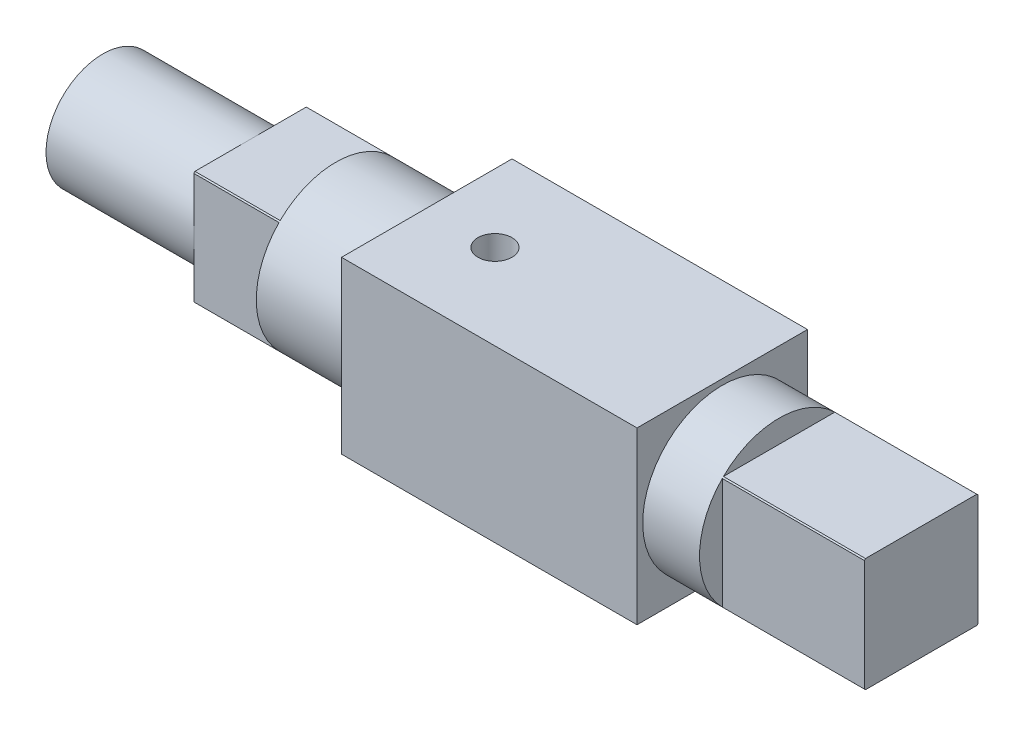
ISO-10303-21;
HEADER;
FILE_DESCRIPTION(('STEP AP214'),'2;1');
FILE_NAME('part.step','',(''),(''),'','','');
FILE_SCHEMA(('AUTOMOTIVE_DESIGN { 1 0 10303 214 1 1 1 1 }'));
ENDSEC;
DATA;
#1=APPLICATION_CONTEXT('core data for automotive mechanical design processes');
#2=APPLICATION_PROTOCOL_DEFINITION('international standard','automotive_design',2000,#1);
#3=PRODUCT_CONTEXT('',#1,'mechanical');
#4=PRODUCT('Part','Part','',(#3));
#5=PRODUCT_RELATED_PRODUCT_CATEGORY('part','',(#4));
#6=PRODUCT_DEFINITION_FORMATION('','',#4);
#7=PRODUCT_DEFINITION_CONTEXT('part definition',#1,'design');
#8=PRODUCT_DEFINITION('design','',#6,#7);
#9=PRODUCT_DEFINITION_SHAPE('','',#8);
#10=(LENGTH_UNIT() NAMED_UNIT(*) SI_UNIT(.MILLI.,.METRE.));
#11=(NAMED_UNIT(*) PLANE_ANGLE_UNIT() SI_UNIT($,.RADIAN.));
#12=(NAMED_UNIT(*) SI_UNIT($,.STERADIAN.) SOLID_ANGLE_UNIT());
#13=UNCERTAINTY_MEASURE_WITH_UNIT(LENGTH_MEASURE(1.E-05),#10,'distance_accuracy_value','');
#14=(GEOMETRIC_REPRESENTATION_CONTEXT(3) GLOBAL_UNCERTAINTY_ASSIGNED_CONTEXT((#13)) GLOBAL_UNIT_ASSIGNED_CONTEXT((#10,
#11,#12)) REPRESENTATION_CONTEXT('',''));
#15=CARTESIAN_POINT('',(0.,0.,0.));
#16=DIRECTION('',(0.,0.,1.));
#17=DIRECTION('',(1.,0.,0.));
#18=AXIS2_PLACEMENT_3D('',#15,#16,#17);
#19=CARTESIAN_POINT('',(18.,7.5,0.));
#20=DIRECTION('',(1.,0.,0.));
#21=DIRECTION('',(0.,0.,-1.));
#22=AXIS2_PLACEMENT_3D('',#19,#20,#21);
#23=PLANE('',#22);
#24=CARTESIAN_POINT('',(18.,7.5,0.));
#25=DIRECTION('',(1.,0.,0.));
#26=DIRECTION('',(0.,0.,-1.));
#27=AXIS2_PLACEMENT_3D('',#24,#25,#26);
#28=CIRCLE('',#27,7.);
#29=CARTESIAN_POINT('',(18.,12.3989794855664,5.));
#30=VERTEX_POINT('',#29);
#31=CARTESIAN_POINT('',(18.,2.60102051443365,5.));
#32=VERTEX_POINT('',#31);
#33=EDGE_CURVE('E435',#30,#32,#28,.T.);
#34=ORIENTED_EDGE('',*,*,#33,.T.);
#35=DIRECTION('',(0.,1.,0.));
#36=VECTOR('',#35,1.);
#37=CARTESIAN_POINT('',(18.,0.,5.));
#38=LINE('',#37,#36);
#39=EDGE_CURVE('E428',#32,#30,#38,.T.);
#40=ORIENTED_EDGE('',*,*,#39,.T.);
#41=EDGE_LOOP('',(#34,#40));
#42=FACE_BOUND('',#41,.T.);
#43=ADVANCED_FACE('F44',(#42),#23,.T.);
#44=CARTESIAN_POINT('',(18.,12.5,-4.89897948556635));
#45=VERTEX_POINT('',#44);
#46=CARTESIAN_POINT('',(18.,12.5,4.89897948556635));
#47=VERTEX_POINT('',#46);
#48=EDGE_CURVE('E229',#45,#47,#28,.T.);
#49=ORIENTED_EDGE('',*,*,#48,.T.);
#50=DIRECTION('',(0.,0.,-1.));
#51=VECTOR('',#50,1.);
#52=CARTESIAN_POINT('',(18.,12.5,0.));
#53=LINE('',#52,#51);
#54=EDGE_CURVE('E459',#47,#45,#53,.T.);
#55=ORIENTED_EDGE('',*,*,#54,.T.);
#56=EDGE_LOOP('',(#49,#55));
#57=FACE_BOUND('',#56,.T.);
#58=ADVANCED_FACE('F399',(#57),#23,.T.);
#59=DIRECTION('',(0.,0.,-1.));
#60=VECTOR('',#59,1.);
#61=CARTESIAN_POINT('',(18.,2.5,0.));
#62=LINE('',#61,#60);
#63=CARTESIAN_POINT('',(18.,2.5,4.89897948556636));
#64=VERTEX_POINT('',#63);
#65=CARTESIAN_POINT('',(18.,2.5,-4.89897948556636));
#66=VERTEX_POINT('',#65);
#67=EDGE_CURVE('E217',#64,#66,#62,.T.);
#68=ORIENTED_EDGE('',*,*,#67,.F.);
#69=EDGE_CURVE('E68',#64,#66,#28,.T.);
#70=ORIENTED_EDGE('',*,*,#69,.T.);
#71=EDGE_LOOP('',(#68,#70));
#72=FACE_BOUND('',#71,.T.);
#73=ADVANCED_FACE('F406',(#72),#23,.T.);
#74=CARTESIAN_POINT('',(-28.5,0.,0.));
#75=DIRECTION('',(-1.,0.,0.));
#76=DIRECTION('',(0.,0.,1.));
#77=AXIS2_PLACEMENT_3D('',#74,#75,#76);
#78=PLANE('',#77);
#79=CARTESIAN_POINT('',(-28.5,7.5,0.));
#80=DIRECTION('',(-1.,0.,0.));
#81=DIRECTION('',(0.,0.,1.));
#82=AXIS2_PLACEMENT_3D('',#79,#80,#81);
#83=CIRCLE('',#82,5.);
#84=CARTESIAN_POINT('',(-28.5,7.5,5.));
#85=VERTEX_POINT('',#84);
#86=CARTESIAN_POINT('',(-28.5,12.5,0.));
#87=VERTEX_POINT('',#86);
#88=EDGE_CURVE('E234',#85,#87,#83,.T.);
#89=ORIENTED_EDGE('',*,*,#88,.F.);
#90=DIRECTION('',(0.,-1.,0.));
#91=VECTOR('',#90,1.);
#92=CARTESIAN_POINT('',(-28.5,0.,5.));
#93=LINE('',#92,#91);
#94=CARTESIAN_POINT('',(-28.5,12.3989794855664,5.));
#95=VERTEX_POINT('',#94);
#96=EDGE_CURVE('E239',#95,#85,#93,.T.);
#97=ORIENTED_EDGE('',*,*,#96,.F.);
#98=CARTESIAN_POINT('',(-28.5,7.5,0.));
#99=DIRECTION('',(-1.,0.,0.));
#100=DIRECTION('',(0.,0.,1.));
#101=AXIS2_PLACEMENT_3D('',#98,#99,#100);
#102=CIRCLE('',#101,7.);
#103=CARTESIAN_POINT('',(-28.5,12.5,4.89897948556636));
#104=VERTEX_POINT('',#103);
#105=EDGE_CURVE('E242',#95,#104,#102,.T.);
#106=ORIENTED_EDGE('',*,*,#105,.T.);
#107=DIRECTION('',(0.,0.,1.));
#108=VECTOR('',#107,1.);
#109=CARTESIAN_POINT('',(-28.5,12.5,0.));
#110=LINE('',#109,#108);
#111=EDGE_CURVE('E247',#87,#104,#110,.T.);
#112=ORIENTED_EDGE('',*,*,#111,.F.);
#113=EDGE_LOOP('',(#89,#97,#106,#112));
#114=FACE_BOUND('',#113,.T.);
#115=ADVANCED_FACE('F417',(#114),#78,.T.);
#116=CARTESIAN_POINT('',(-28.5,7.5,-5.));
#117=VERTEX_POINT('',#116);
#118=EDGE_CURVE('E54',#87,#117,#83,.T.);
#119=ORIENTED_EDGE('',*,*,#118,.F.);
#120=CARTESIAN_POINT('',(-28.5,12.5,-4.89897948556636));
#121=VERTEX_POINT('',#120);
#122=EDGE_CURVE('E250',#121,#87,#110,.T.);
#123=ORIENTED_EDGE('',*,*,#122,.F.);
#124=CARTESIAN_POINT('',(-28.5,12.3989794855664,-5.));
#125=VERTEX_POINT('',#124);
#126=EDGE_CURVE('E249',#121,#125,#102,.T.);
#127=ORIENTED_EDGE('',*,*,#126,.T.);
#128=DIRECTION('',(0.,-1.,0.));
#129=VECTOR('',#128,1.);
#130=CARTESIAN_POINT('',(-28.5,0.,-5.));
#131=LINE('',#130,#129);
#132=EDGE_CURVE('E254',#125,#117,#131,.T.);
#133=ORIENTED_EDGE('',*,*,#132,.T.);
#134=EDGE_LOOP('',(#119,#123,#127,#133));
#135=FACE_BOUND('',#134,.T.);
#136=ADVANCED_FACE('F421',(#135),#78,.T.);
#137=CARTESIAN_POINT('',(-28.5,2.5,0.));
#138=VERTEX_POINT('',#137);
#139=EDGE_CURVE('E887',#117,#138,#83,.T.);
#140=ORIENTED_EDGE('',*,*,#139,.F.);
#141=CARTESIAN_POINT('',(-28.5,2.60102051443364,-5.));
#142=VERTEX_POINT('',#141);
#143=EDGE_CURVE('E259',#117,#142,#131,.T.);
#144=ORIENTED_EDGE('',*,*,#143,.T.);
#145=CARTESIAN_POINT('',(-28.5,2.5,-4.89897948556636));
#146=VERTEX_POINT('',#145);
#147=EDGE_CURVE('E258',#142,#146,#102,.T.);
#148=ORIENTED_EDGE('',*,*,#147,.T.);
#149=DIRECTION('',(0.,0.,1.));
#150=VECTOR('',#149,1.);
#151=CARTESIAN_POINT('',(-28.5,2.5,0.));
#152=LINE('',#151,#150);
#153=EDGE_CURVE('E260',#146,#138,#152,.T.);
#154=ORIENTED_EDGE('',*,*,#153,.T.);
#155=EDGE_LOOP('',(#140,#144,#148,#154));
#156=FACE_BOUND('',#155,.T.);
#157=ADVANCED_FACE('F560',(#156),#78,.T.);
#158=CARTESIAN_POINT('',(-21.,7.5,0.));
#159=DIRECTION('',(-1.,0.,0.));
#160=DIRECTION('',(0.,0.,1.));
#161=AXIS2_PLACEMENT_3D('',#158,#159,#160);
#162=PLANE('',#161);
#163=CARTESIAN_POINT('',(-21.,7.5,0.));
#164=DIRECTION('',(-1.,0.,0.));
#165=DIRECTION('',(0.,0.,1.));
#166=AXIS2_PLACEMENT_3D('',#163,#164,#165);
#167=CIRCLE('',#166,7.);
#168=CARTESIAN_POINT('',(-21.,2.60102051443364,5.));
#169=VERTEX_POINT('',#168);
#170=CARTESIAN_POINT('',(-21.,12.3989794855664,5.));
#171=VERTEX_POINT('',#170);
#172=EDGE_CURVE('E305',#169,#171,#167,.T.);
#173=ORIENTED_EDGE('',*,*,#172,.T.);
#174=DIRECTION('',(0.,-1.,0.));
#175=VECTOR('',#174,1.);
#176=CARTESIAN_POINT('',(-21.,0.,5.));
#177=LINE('',#176,#175);
#178=EDGE_CURVE('E265',#171,#169,#177,.T.);
#179=ORIENTED_EDGE('',*,*,#178,.T.);
#180=EDGE_LOOP('',(#173,#179));
#181=FACE_BOUND('',#180,.T.);
#182=ADVANCED_FACE('F610',(#181),#162,.T.);
#183=DIRECTION('',(0.,0.,1.));
#184=VECTOR('',#183,1.);
#185=CARTESIAN_POINT('',(-21.,2.5,0.));
#186=LINE('',#185,#184);
#187=CARTESIAN_POINT('',(-21.,2.5,-4.89897948556636));
#188=VERTEX_POINT('',#187);
#189=CARTESIAN_POINT('',(-21.,2.5,4.89897948556635));
#190=VERTEX_POINT('',#189);
#191=EDGE_CURVE('E276',#188,#190,#186,.T.);
#192=ORIENTED_EDGE('',*,*,#191,.F.);
#193=EDGE_CURVE('E309',#188,#190,#167,.T.);
#194=ORIENTED_EDGE('',*,*,#193,.T.);
#195=EDGE_LOOP('',(#192,#194));
#196=FACE_BOUND('',#195,.T.);
#197=ADVANCED_FACE('F663',(#196),#162,.T.);
#198=CARTESIAN_POINT('',(-21.,12.5,4.89897948556636));
#199=VERTEX_POINT('',#198);
#200=CARTESIAN_POINT('',(-21.,12.5,-4.89897948556636));
#201=VERTEX_POINT('',#200);
#202=EDGE_CURVE('E310',#199,#201,#167,.T.);
#203=ORIENTED_EDGE('',*,*,#202,.T.);
#204=DIRECTION('',(0.,0.,1.));
#205=VECTOR('',#204,1.);
#206=CARTESIAN_POINT('',(-21.,12.5,0.));
#207=LINE('',#206,#205);
#208=EDGE_CURVE('E269',#201,#199,#207,.T.);
#209=ORIENTED_EDGE('',*,*,#208,.T.);
#210=EDGE_LOOP('',(#203,#209));
#211=FACE_BOUND('',#210,.T.);
#212=ADVANCED_FACE('F611',(#211),#162,.T.);
#213=CARTESIAN_POINT('',(13.,15.,7.5));
#214=DIRECTION('',(-1.,0.,0.));
#215=DIRECTION('',(0.,0.,1.));
#216=AXIS2_PLACEMENT_3D('',#213,#214,#215);
#217=PLANE('',#216);
#218=CARTESIAN_POINT('',(13.,7.5,0.));
#219=DIRECTION('',(1.,0.,0.));
#220=DIRECTION('',(0.,0.,-1.));
#221=AXIS2_PLACEMENT_3D('',#218,#219,#220);
#222=CIRCLE('',#221,7.);
#223=CARTESIAN_POINT('',(13.,7.5,-7.));
#224=VERTEX_POINT('',#223);
#225=EDGE_CURVE('E11',#224,#224,#222,.T.);
#226=ORIENTED_EDGE('',*,*,#225,.F.);
#227=EDGE_LOOP('',(#226));
#228=FACE_BOUND('',#227,.T.);
#229=DIRECTION('',(0.,0.,-1.));
#230=VECTOR('',#229,1.);
#231=CARTESIAN_POINT('',(13.,0.,7.5));
#232=LINE('',#231,#230);
#233=CARTESIAN_POINT('',(13.,0.,7.5));
#234=VERTEX_POINT('',#233);
#235=CARTESIAN_POINT('',(13.,0.,-7.5));
#236=VERTEX_POINT('',#235);
#237=EDGE_CURVE('E320',#234,#236,#232,.T.);
#238=ORIENTED_EDGE('',*,*,#237,.T.);
#239=DIRECTION('',(0.,-1.,0.));
#240=VECTOR('',#239,1.);
#241=CARTESIAN_POINT('',(13.,15.,-7.5));
#242=LINE('',#241,#240);
#243=CARTESIAN_POINT('',(13.,15.,-7.5));
#244=VERTEX_POINT('',#243);
#245=EDGE_CURVE('E315',#244,#236,#242,.T.);
#246=ORIENTED_EDGE('',*,*,#245,.F.);
#247=DIRECTION('',(0.,0.,-1.));
#248=VECTOR('',#247,1.);
#249=CARTESIAN_POINT('',(13.,15.,7.5));
#250=LINE('',#249,#248);
#251=CARTESIAN_POINT('',(13.,15.,7.5));
#252=VERTEX_POINT('',#251);
#253=EDGE_CURVE('E325',#252,#244,#250,.T.);
#254=ORIENTED_EDGE('',*,*,#253,.F.);
#255=DIRECTION('',(0.,-1.,0.));
#256=VECTOR('',#255,1.);
#257=CARTESIAN_POINT('',(13.,15.,7.5));
#258=LINE('',#257,#256);
#259=EDGE_CURVE('E339',#252,#234,#258,.T.);
#260=ORIENTED_EDGE('',*,*,#259,.T.);
#261=EDGE_LOOP('',(#238,#246,#254,#260));
#262=FACE_BOUND('',#261,.T.);
#263=ADVANCED_FACE('F370',(#228,#262),#217,.F.);
#264=CARTESIAN_POINT('',(-13.,15.,-7.5));
#265=DIRECTION('',(0.,0.,1.));
#266=DIRECTION('',(1.,0.,0.));
#267=AXIS2_PLACEMENT_3D('',#264,#265,#266);
#268=PLANE('',#267);
#269=DIRECTION('',(-1.,0.,0.));
#270=VECTOR('',#269,1.);
#271=CARTESIAN_POINT('',(-13.,0.,-7.5));
#272=LINE('',#271,#270);
#273=CARTESIAN_POINT('',(-13.,0.,-7.5));
#274=VERTEX_POINT('',#273);
#275=EDGE_CURVE('E343',#236,#274,#272,.T.);
#276=ORIENTED_EDGE('',*,*,#275,.T.);
#277=DIRECTION('',(0.,-1.,0.));
#278=VECTOR('',#277,1.);
#279=CARTESIAN_POINT('',(-13.,15.,-7.5));
#280=LINE('',#279,#278);
#281=CARTESIAN_POINT('',(-13.,15.,-7.5));
#282=VERTEX_POINT('',#281);
#283=EDGE_CURVE('E358',#282,#274,#280,.T.);
#284=ORIENTED_EDGE('',*,*,#283,.F.);
#285=DIRECTION('',(-1.,0.,0.));
#286=VECTOR('',#285,1.);
#287=CARTESIAN_POINT('',(-13.,15.,-7.5));
#288=LINE('',#287,#286);
#289=EDGE_CURVE('E329',#244,#282,#288,.T.);
#290=ORIENTED_EDGE('',*,*,#289,.F.);
#291=ORIENTED_EDGE('',*,*,#245,.T.);
#292=EDGE_LOOP('',(#276,#284,#290,#291));
#293=FACE_BOUND('',#292,.T.);
#294=ADVANCED_FACE('F365',(#293),#268,.F.);
#295=CARTESIAN_POINT('',(-13.,15.,7.5));
#296=DIRECTION('',(1.,0.,0.));
#297=DIRECTION('',(0.,0.,-1.));
#298=AXIS2_PLACEMENT_3D('',#295,#296,#297);
#299=PLANE('',#298);
#300=CARTESIAN_POINT('',(-13.,7.5,0.));
#301=DIRECTION('',(-1.,0.,0.));
#302=DIRECTION('',(0.,0.,1.));
#303=AXIS2_PLACEMENT_3D('',#300,#301,#302);
#304=CIRCLE('',#303,7.);
#305=CARTESIAN_POINT('',(-13.,7.5,7.));
#306=VERTEX_POINT('',#305);
#307=EDGE_CURVE('E311',#306,#306,#304,.T.);
#308=ORIENTED_EDGE('',*,*,#307,.F.);
#309=EDGE_LOOP('',(#308));
#310=FACE_BOUND('',#309,.T.);
#311=DIRECTION('',(0.,0.,1.));
#312=VECTOR('',#311,1.);
#313=CARTESIAN_POINT('',(-13.,0.,7.5));
#314=LINE('',#313,#312);
#315=CARTESIAN_POINT('',(-13.,0.,7.5));
#316=VERTEX_POINT('',#315);
#317=EDGE_CURVE('E346',#274,#316,#314,.T.);
#318=ORIENTED_EDGE('',*,*,#317,.T.);
#319=DIRECTION('',(0.,-1.,0.));
#320=VECTOR('',#319,1.);
#321=CARTESIAN_POINT('',(-13.,15.,7.5));
#322=LINE('',#321,#320);
#323=CARTESIAN_POINT('',(-13.,15.,7.5));
#324=VERTEX_POINT('',#323);
#325=EDGE_CURVE('E354',#324,#316,#322,.T.);
#326=ORIENTED_EDGE('',*,*,#325,.F.);
#327=DIRECTION('',(0.,0.,1.));
#328=VECTOR('',#327,1.);
#329=CARTESIAN_POINT('',(-13.,15.,7.5));
#330=LINE('',#329,#328);
#331=EDGE_CURVE('E333',#282,#324,#330,.T.);
#332=ORIENTED_EDGE('',*,*,#331,.F.);
#333=ORIENTED_EDGE('',*,*,#283,.T.);
#334=EDGE_LOOP('',(#318,#326,#332,#333));
#335=FACE_BOUND('',#334,.T.);
#336=ADVANCED_FACE('F378',(#310,#335),#299,.F.);
#337=CARTESIAN_POINT('',(-13.,15.,7.5));
#338=DIRECTION('',(0.,0.,-1.));
#339=DIRECTION('',(-1.,0.,0.));
#340=AXIS2_PLACEMENT_3D('',#337,#338,#339);
#341=PLANE('',#340);
#342=DIRECTION('',(1.,0.,0.));
#343=VECTOR('',#342,1.);
#344=CARTESIAN_POINT('',(-13.,0.,7.5));
#345=LINE('',#344,#343);
#346=EDGE_CURVE('E330',#316,#234,#345,.T.);
#347=ORIENTED_EDGE('',*,*,#346,.T.);
#348=ORIENTED_EDGE('',*,*,#259,.F.);
#349=DIRECTION('',(1.,0.,0.));
#350=VECTOR('',#349,1.);
#351=CARTESIAN_POINT('',(-13.,15.,7.5));
#352=LINE('',#351,#350);
#353=EDGE_CURVE('E336',#324,#252,#352,.T.);
#354=ORIENTED_EDGE('',*,*,#353,.F.);
#355=ORIENTED_EDGE('',*,*,#325,.T.);
#356=EDGE_LOOP('',(#347,#348,#354,#355));
#357=FACE_BOUND('',#356,.T.);
#358=ADVANCED_FACE('F382',(#357),#341,.F.);
#359=CARTESIAN_POINT('',(0.,15.,0.));
#360=DIRECTION('',(0.,-1.,0.));
#361=DIRECTION('',(0.,0.,-1.));
#362=AXIS2_PLACEMENT_3D('',#359,#360,#361);
#363=PLANE('',#362);
#364=CARTESIAN_POINT('',(-6.99999999999999,15.,0.));
#365=DIRECTION('',(0.,1.,0.));
#366=DIRECTION('',(0.,0.,1.));
#367=AXIS2_PLACEMENT_3D('',#364,#365,#366);
#368=CIRCLE('',#367,1.5);
#369=CARTESIAN_POINT('',(-6.99999999999999,15.,1.5));
#370=VERTEX_POINT('',#369);
#371=EDGE_CURVE('E321',#370,#370,#368,.T.);
#372=ORIENTED_EDGE('',*,*,#371,.F.);
#373=EDGE_LOOP('',(#372));
#374=FACE_BOUND('',#373,.T.);
#375=ORIENTED_EDGE('',*,*,#253,.T.);
#376=ORIENTED_EDGE('',*,*,#289,.T.);
#377=ORIENTED_EDGE('',*,*,#331,.T.);
#378=ORIENTED_EDGE('',*,*,#353,.T.);
#379=EDGE_LOOP('',(#375,#376,#377,#378));
#380=FACE_BOUND('',#379,.T.);
#381=ADVANCED_FACE('F384',(#374,#380),#363,.F.);
#382=CARTESIAN_POINT('',(0.,0.,0.));
#383=DIRECTION('',(0.,-1.,0.));
#384=DIRECTION('',(0.,0.,-1.));
#385=AXIS2_PLACEMENT_3D('',#382,#383,#384);
#386=PLANE('',#385);
#387=CARTESIAN_POINT('',(-6.99999999999999,0.,0.));
#388=DIRECTION('',(0.,1.,0.));
#389=DIRECTION('',(0.,0.,1.));
#390=AXIS2_PLACEMENT_3D('',#387,#388,#389);
#391=CIRCLE('',#390,1.5);
#392=CARTESIAN_POINT('',(-6.99999999999999,0.,1.5));
#393=VERTEX_POINT('',#392);
#394=EDGE_CURVE('E316',#393,#393,#391,.T.);
#395=ORIENTED_EDGE('',*,*,#394,.T.);
#396=EDGE_LOOP('',(#395));
#397=FACE_BOUND('',#396,.T.);
#398=ORIENTED_EDGE('',*,*,#237,.F.);
#399=ORIENTED_EDGE('',*,*,#346,.F.);
#400=ORIENTED_EDGE('',*,*,#317,.F.);
#401=ORIENTED_EDGE('',*,*,#275,.F.);
#402=EDGE_LOOP('',(#398,#399,#400,#401));
#403=FACE_BOUND('',#402,.T.);
#404=ADVANCED_FACE('F374',(#397,#403),#386,.T.);
#405=CARTESIAN_POINT('',(-6.99999999999999,0.,0.));
#406=DIRECTION('',(0.,1.,0.));
#407=DIRECTION('',(0.,0.,1.));
#408=AXIS2_PLACEMENT_3D('',#405,#406,#407);
#409=CYLINDRICAL_SURFACE('',#408,1.5);
#410=ORIENTED_EDGE('',*,*,#394,.F.);
#411=EDGE_LOOP('',(#410));
#412=FACE_BOUND('',#411,.T.);
#413=ORIENTED_EDGE('',*,*,#371,.T.);
#414=EDGE_LOOP('',(#413));
#415=FACE_BOUND('',#414,.T.);
#416=ADVANCED_FACE('F392',(#412,#415),#409,.F.);
#417=CARTESIAN_POINT('',(-21.,7.5,0.));
#418=DIRECTION('',(1.,0.,0.));
#419=DIRECTION('',(0.,0.,-1.));
#420=AXIS2_PLACEMENT_3D('',#417,#418,#419);
#421=CYLINDRICAL_SURFACE('',#420,7.);
#422=ORIENTED_EDGE('',*,*,#202,.F.);
#423=DIRECTION('',(1.,0.,0.));
#424=VECTOR('',#423,1.);
#425=CARTESIAN_POINT('',(-28.5,12.5,4.89897948556636));
#426=LINE('',#425,#424);
#427=EDGE_CURVE('E299',#104,#199,#426,.T.);
#428=ORIENTED_EDGE('',*,*,#427,.F.);
#429=ORIENTED_EDGE('',*,*,#105,.F.);
#430=DIRECTION('',(1.,0.,0.));
#431=VECTOR('',#430,1.);
#432=CARTESIAN_POINT('',(-28.5,12.3989794855664,5.));
#433=LINE('',#432,#431);
#434=EDGE_CURVE('E302',#95,#171,#433,.T.);
#435=ORIENTED_EDGE('',*,*,#434,.T.);
#436=ORIENTED_EDGE('',*,*,#172,.F.);
#437=DIRECTION('',(1.,0.,0.));
#438=VECTOR('',#437,1.);
#439=CARTESIAN_POINT('',(-28.5,2.60102051443364,5.));
#440=LINE('',#439,#438);
#441=CARTESIAN_POINT('',(-28.5,2.60102051443364,5.));
#442=VERTEX_POINT('',#441);
#443=EDGE_CURVE('E279',#442,#169,#440,.T.);
#444=ORIENTED_EDGE('',*,*,#443,.F.);
#445=CARTESIAN_POINT('',(-28.5,2.5,4.89897948556635));
#446=VERTEX_POINT('',#445);
#447=EDGE_CURVE('E248',#446,#442,#102,.T.);
#448=ORIENTED_EDGE('',*,*,#447,.F.);
#449=DIRECTION('',(1.,0.,0.));
#450=VECTOR('',#449,1.);
#451=CARTESIAN_POINT('',(-28.5,2.5,4.89897948556635));
#452=LINE('',#451,#450);
#453=EDGE_CURVE('E282',#446,#190,#452,.T.);
#454=ORIENTED_EDGE('',*,*,#453,.T.);
#455=ORIENTED_EDGE('',*,*,#193,.F.);
#456=DIRECTION('',(1.,0.,0.));
#457=VECTOR('',#456,1.);
#458=CARTESIAN_POINT('',(-28.5,2.5,-4.89897948556636));
#459=LINE('',#458,#457);
#460=EDGE_CURVE('E286',#146,#188,#459,.T.);
#461=ORIENTED_EDGE('',*,*,#460,.F.);
#462=ORIENTED_EDGE('',*,*,#147,.F.);
#463=DIRECTION('',(1.,0.,0.));
#464=VECTOR('',#463,1.);
#465=CARTESIAN_POINT('',(-28.5,2.60102051443364,-5.));
#466=LINE('',#465,#464);
#467=CARTESIAN_POINT('',(-21.,2.60102051443364,-5.));
#468=VERTEX_POINT('',#467);
#469=EDGE_CURVE('E289',#142,#468,#466,.T.);
#470=ORIENTED_EDGE('',*,*,#469,.T.);
#471=CARTESIAN_POINT('',(-21.,12.3989794855664,-5.));
#472=VERTEX_POINT('',#471);
#473=EDGE_CURVE('E916',#472,#468,#167,.T.);
#474=ORIENTED_EDGE('',*,*,#473,.F.);
#475=DIRECTION('',(1.,0.,0.));
#476=VECTOR('',#475,1.);
#477=CARTESIAN_POINT('',(-28.5,12.3989794855664,-5.));
#478=LINE('',#477,#476);
#479=EDGE_CURVE('E293',#125,#472,#478,.T.);
#480=ORIENTED_EDGE('',*,*,#479,.F.);
#481=ORIENTED_EDGE('',*,*,#126,.F.);
#482=DIRECTION('',(1.,0.,0.));
#483=VECTOR('',#482,1.);
#484=CARTESIAN_POINT('',(-28.5,12.5,-4.89897948556636));
#485=LINE('',#484,#483);
#486=EDGE_CURVE('E296',#121,#201,#485,.T.);
#487=ORIENTED_EDGE('',*,*,#486,.T.);
#488=EDGE_LOOP('',(#422,#428,#429,#435,#436,#444,#448,#454,#455,#461,#462,#470,#474,#480,#481,#487));
#489=FACE_BOUND('',#488,.T.);
#490=ORIENTED_EDGE('',*,*,#307,.T.);
#491=EDGE_LOOP('',(#490));
#492=FACE_BOUND('',#491,.T.);
#493=ADVANCED_FACE('F607',(#489,#492),#421,.T.);
#494=DIRECTION('',(0.,-1.,0.));
#495=VECTOR('',#494,1.);
#496=CARTESIAN_POINT('',(-21.,0.,-5.));
#497=LINE('',#496,#495);
#498=EDGE_CURVE('E273',#472,#468,#497,.T.);
#499=ORIENTED_EDGE('',*,*,#498,.F.);
#500=ORIENTED_EDGE('',*,*,#473,.T.);
#501=EDGE_LOOP('',(#499,#500));
#502=FACE_BOUND('',#501,.T.);
#503=ADVANCED_FACE('F599',(#502),#162,.T.);
#504=CARTESIAN_POINT('',(-28.5,0.,5.));
#505=DIRECTION('',(0.,0.,1.));
#506=DIRECTION('',(0.,-1.,0.));
#507=AXIS2_PLACEMENT_3D('',#504,#505,#506);
#508=PLANE('',#507);
#509=ORIENTED_EDGE('',*,*,#178,.F.);
#510=ORIENTED_EDGE('',*,*,#434,.F.);
#511=ORIENTED_EDGE('',*,*,#96,.T.);
#512=EDGE_CURVE('E243',#85,#442,#93,.T.);
#513=ORIENTED_EDGE('',*,*,#512,.T.);
#514=ORIENTED_EDGE('',*,*,#443,.T.);
#515=EDGE_LOOP('',(#509,#510,#511,#513,#514));
#516=FACE_BOUND('',#515,.T.);
#517=ADVANCED_FACE('F590',(#516),#508,.T.);
#518=CARTESIAN_POINT('',(-28.5,12.5,0.));
#519=DIRECTION('',(0.,1.,0.));
#520=DIRECTION('',(0.,0.,1.));
#521=AXIS2_PLACEMENT_3D('',#518,#519,#520);
#522=PLANE('',#521);
#523=ORIENTED_EDGE('',*,*,#208,.F.);
#524=ORIENTED_EDGE('',*,*,#486,.F.);
#525=ORIENTED_EDGE('',*,*,#122,.T.);
#526=ORIENTED_EDGE('',*,*,#111,.T.);
#527=ORIENTED_EDGE('',*,*,#427,.T.);
#528=EDGE_LOOP('',(#523,#524,#525,#526,#527));
#529=FACE_BOUND('',#528,.T.);
#530=ADVANCED_FACE('F579',(#529),#522,.T.);
#531=CARTESIAN_POINT('',(-28.5,0.,-5.));
#532=DIRECTION('',(0.,0.,1.));
#533=DIRECTION('',(0.,-1.,0.));
#534=AXIS2_PLACEMENT_3D('',#531,#532,#533);
#535=PLANE('',#534);
#536=ORIENTED_EDGE('',*,*,#498,.T.);
#537=ORIENTED_EDGE('',*,*,#469,.F.);
#538=ORIENTED_EDGE('',*,*,#143,.F.);
#539=ORIENTED_EDGE('',*,*,#132,.F.);
#540=ORIENTED_EDGE('',*,*,#479,.T.);
#541=EDGE_LOOP('',(#536,#537,#538,#539,#540));
#542=FACE_BOUND('',#541,.T.);
#543=ADVANCED_FACE('F568',(#542),#535,.F.);
#544=CARTESIAN_POINT('',(-28.5,2.5,0.));
#545=DIRECTION('',(0.,1.,0.));
#546=DIRECTION('',(0.,0.,1.));
#547=AXIS2_PLACEMENT_3D('',#544,#545,#546);
#548=PLANE('',#547);
#549=ORIENTED_EDGE('',*,*,#191,.T.);
#550=ORIENTED_EDGE('',*,*,#453,.F.);
#551=EDGE_CURVE('E264',#138,#446,#152,.T.);
#552=ORIENTED_EDGE('',*,*,#551,.F.);
#553=ORIENTED_EDGE('',*,*,#153,.F.);
#554=ORIENTED_EDGE('',*,*,#460,.T.);
#555=EDGE_LOOP('',(#549,#550,#552,#553,#554));
#556=FACE_BOUND('',#555,.T.);
#557=ADVANCED_FACE('F558',(#556),#548,.F.);
#558=EDGE_CURVE('E238',#138,#85,#83,.T.);
#559=ORIENTED_EDGE('',*,*,#558,.F.);
#560=ORIENTED_EDGE('',*,*,#551,.T.);
#561=ORIENTED_EDGE('',*,*,#447,.T.);
#562=ORIENTED_EDGE('',*,*,#512,.F.);
#563=EDGE_LOOP('',(#559,#560,#561,#562));
#564=FACE_BOUND('',#563,.T.);
#565=ADVANCED_FACE('F424',(#564),#78,.T.);
#566=CARTESIAN_POINT('',(-41.5,7.5,0.));
#567=DIRECTION('',(1.,0.,0.));
#568=DIRECTION('',(0.,0.,-1.));
#569=AXIS2_PLACEMENT_3D('',#566,#567,#568);
#570=CYLINDRICAL_SURFACE('',#569,5.);
#571=CARTESIAN_POINT('',(-41.5,7.5,0.));
#572=DIRECTION('',(-1.,0.,0.));
#573=DIRECTION('',(0.,0.,1.));
#574=AXIS2_PLACEMENT_3D('',#571,#572,#573);
#575=CIRCLE('',#574,5.);
#576=CARTESIAN_POINT('',(-41.5,7.5,5.));
#577=VERTEX_POINT('',#576);
#578=EDGE_CURVE('E48',#577,#577,#575,.T.);
#579=ORIENTED_EDGE('',*,*,#578,.F.);
#580=EDGE_LOOP('',(#579));
#581=FACE_BOUND('',#580,.T.);
#582=ORIENTED_EDGE('',*,*,#88,.T.);
#583=ORIENTED_EDGE('',*,*,#118,.T.);
#584=ORIENTED_EDGE('',*,*,#139,.T.);
#585=ORIENTED_EDGE('',*,*,#558,.T.);
#586=EDGE_LOOP('',(#582,#583,#584,#585));
#587=FACE_BOUND('',#586,.T.);
#588=ADVANCED_FACE('F540',(#581,#587),#570,.T.);
#589=CARTESIAN_POINT('',(-32.5346153846154,7.5,0.));
#590=DIRECTION('',(0.,0.,1.));
#591=DIRECTION('',(1.,0.,0.));
#592=AXIS2_PLACEMENT_3D('',#589,#590,#591);
#593=SPHERICAL_SURFACE('',#592,10.2653846153846);
#594=CARTESIAN_POINT('',(-32.5346153846154,7.5,0.));
#595=DIRECTION('',(-1.,0.,0.));
#596=DIRECTION('',(0.,0.,1.));
#597=AXIS2_PLACEMENT_3D('',#594,#595,#596);
#598=SPHERICAL_SURFACE('',#597,10.2653846153846);
#599=ORIENTED_EDGE('',*,*,#578,.T.);
#600=EDGE_LOOP('',(#599));
#601=FACE_BOUND('',#600,.T.);
#602=ADVANCED_FACE('F46',(#601),#598,.T.);
#603=CARTESIAN_POINT('',(18.,7.5,0.));
#604=DIRECTION('',(-1.,0.,0.));
#605=DIRECTION('',(0.,0.,1.));
#606=AXIS2_PLACEMENT_3D('',#603,#604,#605);
#607=CYLINDRICAL_SURFACE('',#606,7.);
#608=ORIENTED_EDGE('',*,*,#48,.F.);
#609=DIRECTION('',(-1.,0.,0.));
#610=VECTOR('',#609,1.);
#611=CARTESIAN_POINT('',(30.5,12.5,-4.89897948556635));
#612=LINE('',#611,#610);
#613=CARTESIAN_POINT('',(30.5,12.5,-4.89897948556635));
#614=VERTEX_POINT('',#613);
#615=EDGE_CURVE('E230',#614,#45,#612,.T.);
#616=ORIENTED_EDGE('',*,*,#615,.F.);
#617=CARTESIAN_POINT('',(30.5,7.5,0.));
#618=DIRECTION('',(1.,0.,0.));
#619=DIRECTION('',(0.,0.,-1.));
#620=AXIS2_PLACEMENT_3D('',#617,#618,#619);
#621=CIRCLE('',#620,7.);
#622=CARTESIAN_POINT('',(30.5,12.3989794855664,-5.));
#623=VERTEX_POINT('',#622);
#624=EDGE_CURVE('E206',#623,#614,#621,.T.);
#625=ORIENTED_EDGE('',*,*,#624,.F.);
#626=DIRECTION('',(-1.,0.,0.));
#627=VECTOR('',#626,1.);
#628=CARTESIAN_POINT('',(30.5,12.3989794855664,-5.));
#629=LINE('',#628,#627);
#630=CARTESIAN_POINT('',(18.,12.3989794855664,-5.));
#631=VERTEX_POINT('',#630);
#632=EDGE_CURVE('E202',#623,#631,#629,.T.);
#633=ORIENTED_EDGE('',*,*,#632,.T.);
#634=CARTESIAN_POINT('',(18.,2.60102051443364,-5.));
#635=VERTEX_POINT('',#634);
#636=EDGE_CURVE('E223',#635,#631,#28,.T.);
#637=ORIENTED_EDGE('',*,*,#636,.F.);
#638=DIRECTION('',(-1.,0.,0.));
#639=VECTOR('',#638,1.);
#640=CARTESIAN_POINT('',(30.5,2.60102051443364,-5.));
#641=LINE('',#640,#639);
#642=CARTESIAN_POINT('',(30.5,2.60102051443364,-5.));
#643=VERTEX_POINT('',#642);
#644=EDGE_CURVE('E200',#643,#635,#641,.T.);
#645=ORIENTED_EDGE('',*,*,#644,.F.);
#646=CARTESIAN_POINT('',(30.5,2.5,-4.89897948556636));
#647=VERTEX_POINT('',#646);
#648=EDGE_CURVE('E207',#647,#643,#621,.T.);
#649=ORIENTED_EDGE('',*,*,#648,.F.);
#650=DIRECTION('',(-1.,0.,0.));
#651=VECTOR('',#650,1.);
#652=CARTESIAN_POINT('',(30.5,2.5,-4.89897948556636));
#653=LINE('',#652,#651);
#654=EDGE_CURVE('E433',#647,#66,#653,.T.);
#655=ORIENTED_EDGE('',*,*,#654,.T.);
#656=ORIENTED_EDGE('',*,*,#69,.F.);
#657=DIRECTION('',(-1.,0.,0.));
#658=VECTOR('',#657,1.);
#659=CARTESIAN_POINT('',(30.5,2.5,4.89897948556636));
#660=LINE('',#659,#658);
#661=CARTESIAN_POINT('',(30.5,2.5,4.89897948556636));
#662=VERTEX_POINT('',#661);
#663=EDGE_CURVE('E432',#662,#64,#660,.T.);
#664=ORIENTED_EDGE('',*,*,#663,.F.);
#665=CARTESIAN_POINT('',(30.5,2.60102051443365,5.));
#666=VERTEX_POINT('',#665);
#667=EDGE_CURVE('E219',#666,#662,#621,.T.);
#668=ORIENTED_EDGE('',*,*,#667,.F.);
#669=DIRECTION('',(-1.,0.,0.));
#670=VECTOR('',#669,1.);
#671=CARTESIAN_POINT('',(30.5,2.60102051443365,5.));
#672=LINE('',#671,#670);
#673=EDGE_CURVE('E438',#666,#32,#672,.T.);
#674=ORIENTED_EDGE('',*,*,#673,.T.);
#675=ORIENTED_EDGE('',*,*,#33,.F.);
#676=DIRECTION('',(-1.,0.,0.));
#677=VECTOR('',#676,1.);
#678=CARTESIAN_POINT('',(30.5,12.3989794855664,5.));
#679=LINE('',#678,#677);
#680=CARTESIAN_POINT('',(30.5,12.3989794855664,5.));
#681=VERTEX_POINT('',#680);
#682=EDGE_CURVE('E443',#681,#30,#679,.T.);
#683=ORIENTED_EDGE('',*,*,#682,.F.);
#684=CARTESIAN_POINT('',(30.5,12.5,4.89897948556635));
#685=VERTEX_POINT('',#684);
#686=EDGE_CURVE('E484',#685,#681,#621,.T.);
#687=ORIENTED_EDGE('',*,*,#686,.F.);
#688=DIRECTION('',(-1.,0.,0.));
#689=VECTOR('',#688,1.);
#690=CARTESIAN_POINT('',(30.5,12.5,4.89897948556635));
#691=LINE('',#690,#689);
#692=EDGE_CURVE('E450',#685,#47,#691,.T.);
#693=ORIENTED_EDGE('',*,*,#692,.T.);
#694=EDGE_LOOP('',(#608,#616,#625,#633,#637,#645,#649,#655,#656,#664,#668,#674,#675,#683,#687,#693));
#695=FACE_BOUND('',#694,.T.);
#696=ORIENTED_EDGE('',*,*,#225,.T.);
#697=EDGE_LOOP('',(#696));
#698=FACE_BOUND('',#697,.T.);
#699=ADVANCED_FACE('F221',(#695,#698),#607,.T.);
#700=DIRECTION('',(0.,1.,0.));
#701=VECTOR('',#700,1.);
#702=CARTESIAN_POINT('',(18.,0.,-5.));
#703=LINE('',#702,#701);
#704=EDGE_CURVE('E61',#635,#631,#703,.T.);
#705=ORIENTED_EDGE('',*,*,#704,.F.);
#706=ORIENTED_EDGE('',*,*,#636,.T.);
#707=EDGE_LOOP('',(#705,#706));
#708=FACE_BOUND('',#707,.T.);
#709=ADVANCED_FACE('F402',(#708),#23,.T.);
#710=CARTESIAN_POINT('',(30.5,0.,-5.));
#711=DIRECTION('',(0.,0.,1.));
#712=DIRECTION('',(0.,-1.,0.));
#713=AXIS2_PLACEMENT_3D('',#710,#711,#712);
#714=PLANE('',#713);
#715=ORIENTED_EDGE('',*,*,#704,.T.);
#716=ORIENTED_EDGE('',*,*,#632,.F.);
#717=DIRECTION('',(0.,1.,0.));
#718=VECTOR('',#717,1.);
#719=CARTESIAN_POINT('',(30.5,0.,-5.));
#720=LINE('',#719,#718);
#721=EDGE_CURVE('E196',#643,#623,#720,.T.);
#722=ORIENTED_EDGE('',*,*,#721,.F.);
#723=ORIENTED_EDGE('',*,*,#644,.T.);
#724=EDGE_LOOP('',(#715,#716,#722,#723));
#725=FACE_BOUND('',#724,.T.);
#726=ADVANCED_FACE('F198',(#725),#714,.F.);
#727=CARTESIAN_POINT('',(30.5,12.5,0.));
#728=DIRECTION('',(0.,1.,0.));
#729=DIRECTION('',(0.,0.,1.));
#730=AXIS2_PLACEMENT_3D('',#727,#728,#729);
#731=PLANE('',#730);
#732=ORIENTED_EDGE('',*,*,#54,.F.);
#733=ORIENTED_EDGE('',*,*,#692,.F.);
#734=DIRECTION('',(0.,0.,-1.));
#735=VECTOR('',#734,1.);
#736=CARTESIAN_POINT('',(30.5,12.5,0.));
#737=LINE('',#736,#735);
#738=EDGE_CURVE('E461',#685,#614,#737,.T.);
#739=ORIENTED_EDGE('',*,*,#738,.T.);
#740=ORIENTED_EDGE('',*,*,#615,.T.);
#741=EDGE_LOOP('',(#732,#733,#739,#740));
#742=FACE_BOUND('',#741,.T.);
#743=ADVANCED_FACE('F415',(#742),#731,.T.);
#744=CARTESIAN_POINT('',(30.5,0.,5.));
#745=DIRECTION('',(0.,0.,1.));
#746=DIRECTION('',(0.,-1.,0.));
#747=AXIS2_PLACEMENT_3D('',#744,#745,#746);
#748=PLANE('',#747);
#749=ORIENTED_EDGE('',*,*,#39,.F.);
#750=ORIENTED_EDGE('',*,*,#673,.F.);
#751=DIRECTION('',(0.,1.,0.));
#752=VECTOR('',#751,1.);
#753=CARTESIAN_POINT('',(30.5,0.,5.));
#754=LINE('',#753,#752);
#755=EDGE_CURVE('E481',#666,#681,#754,.T.);
#756=ORIENTED_EDGE('',*,*,#755,.T.);
#757=ORIENTED_EDGE('',*,*,#682,.T.);
#758=EDGE_LOOP('',(#749,#750,#756,#757));
#759=FACE_BOUND('',#758,.T.);
#760=ADVANCED_FACE('F471',(#759),#748,.T.);
#761=CARTESIAN_POINT('',(30.5,2.5,0.));
#762=DIRECTION('',(0.,1.,0.));
#763=DIRECTION('',(0.,0.,1.));
#764=AXIS2_PLACEMENT_3D('',#761,#762,#763);
#765=PLANE('',#764);
#766=ORIENTED_EDGE('',*,*,#67,.T.);
#767=ORIENTED_EDGE('',*,*,#654,.F.);
#768=DIRECTION('',(0.,0.,-1.));
#769=VECTOR('',#768,1.);
#770=CARTESIAN_POINT('',(30.5,2.5,0.));
#771=LINE('',#770,#769);
#772=EDGE_CURVE('E212',#662,#647,#771,.T.);
#773=ORIENTED_EDGE('',*,*,#772,.F.);
#774=ORIENTED_EDGE('',*,*,#663,.T.);
#775=EDGE_LOOP('',(#766,#767,#773,#774));
#776=FACE_BOUND('',#775,.T.);
#777=ADVANCED_FACE('F436',(#776),#765,.F.);
#778=CARTESIAN_POINT('',(30.5,0.,0.));
#779=DIRECTION('',(1.,0.,0.));
#780=DIRECTION('',(0.,0.,-1.));
#781=AXIS2_PLACEMENT_3D('',#778,#779,#780);
#782=PLANE('',#781);
#783=ORIENTED_EDGE('',*,*,#648,.T.);
#784=ORIENTED_EDGE('',*,*,#721,.T.);
#785=ORIENTED_EDGE('',*,*,#624,.T.);
#786=ORIENTED_EDGE('',*,*,#738,.F.);
#787=ORIENTED_EDGE('',*,*,#686,.T.);
#788=ORIENTED_EDGE('',*,*,#755,.F.);
#789=ORIENTED_EDGE('',*,*,#667,.T.);
#790=ORIENTED_EDGE('',*,*,#772,.T.);
#791=EDGE_LOOP('',(#783,#784,#785,#786,#787,#788,#789,#790));
#792=FACE_BOUND('',#791,.T.);
#793=ADVANCED_FACE('F210',(#792),#782,.T.);
#794=CLOSED_SHELL('',(#43,#58,#73,#115,#136,#157,#182,#197,#212,#263,#294,#336,#358,#381,#404,
#416,#493,#503,#517,#530,#543,#557,#565,#588,#602,#699,#709,#726,#743,#760,#777,#793));
#795=MANIFOLD_SOLID_BREP('B2',#794);
#796=ADVANCED_BREP_SHAPE_REPRESENTATION('',(#18,#795),#14);
#797=SHAPE_DEFINITION_REPRESENTATION(#9,#796);
ENDSEC;
END-ISO-10303-21;
